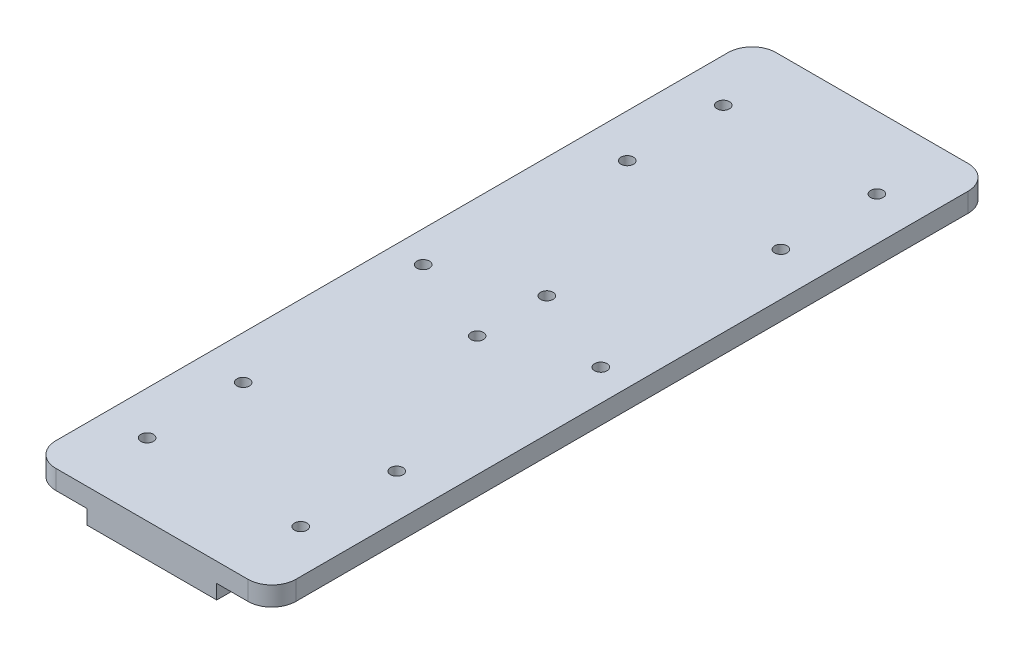
ISO-10303-21;
HEADER;
FILE_DESCRIPTION(('STEP AP214'),'2;1');
FILE_NAME('part.step','',(''),(''),'','','');
FILE_SCHEMA(('AUTOMOTIVE_DESIGN { 1 0 10303 214 1 1 1 1 }'));
ENDSEC;
DATA;
#1=APPLICATION_CONTEXT('core data for automotive mechanical design processes');
#2=APPLICATION_PROTOCOL_DEFINITION('international standard','automotive_design',2000,#1);
#3=PRODUCT_CONTEXT('',#1,'mechanical');
#4=PRODUCT('Part','Part','',(#3));
#5=PRODUCT_RELATED_PRODUCT_CATEGORY('part','',(#4));
#6=PRODUCT_DEFINITION_FORMATION('','',#4);
#7=PRODUCT_DEFINITION_CONTEXT('part definition',#1,'design');
#8=PRODUCT_DEFINITION('design','',#6,#7);
#9=PRODUCT_DEFINITION_SHAPE('','',#8);
#10=(LENGTH_UNIT() NAMED_UNIT(*) SI_UNIT(.MILLI.,.METRE.));
#11=(NAMED_UNIT(*) PLANE_ANGLE_UNIT() SI_UNIT($,.RADIAN.));
#12=(NAMED_UNIT(*) SI_UNIT($,.STERADIAN.) SOLID_ANGLE_UNIT());
#13=UNCERTAINTY_MEASURE_WITH_UNIT(LENGTH_MEASURE(1.E-05),#10,'distance_accuracy_value','');
#14=(GEOMETRIC_REPRESENTATION_CONTEXT(3) GLOBAL_UNCERTAINTY_ASSIGNED_CONTEXT((#13)) GLOBAL_UNIT_ASSIGNED_CONTEXT((#10,
#11,#12)) REPRESENTATION_CONTEXT('',''));
#15=CARTESIAN_POINT('',(0.,0.,0.));
#16=DIRECTION('',(0.,0.,1.));
#17=DIRECTION('',(1.,0.,0.));
#18=AXIS2_PLACEMENT_3D('',#15,#16,#17);
#19=CARTESIAN_POINT('',(0.,0.,0.));
#20=DIRECTION('',(0.,1.,0.));
#21=DIRECTION('',(0.,0.,1.));
#22=AXIS2_PLACEMENT_3D('',#19,#20,#21);
#23=PLANE('',#22);
#24=CARTESIAN_POINT('',(0.,0.,7.24999999999999));
#25=DIRECTION('',(0.,1.,0.));
#26=DIRECTION('',(0.,0.,1.));
#27=AXIS2_PLACEMENT_3D('',#24,#25,#26);
#28=CIRCLE('',#27,1.3);
#29=CARTESIAN_POINT('',(0.,0.,8.54999999999999));
#30=VERTEX_POINT('',#29);
#31=EDGE_CURVE('E271',#30,#30,#28,.T.);
#32=ORIENTED_EDGE('',*,*,#31,.T.);
#33=EDGE_LOOP('',(#32));
#34=FACE_BOUND('',#33,.T.);
#35=CARTESIAN_POINT('',(-18.5,0.,0.));
#36=DIRECTION('',(0.,1.,0.));
#37=DIRECTION('',(0.,0.,1.));
#38=AXIS2_PLACEMENT_3D('',#35,#36,#37);
#39=CIRCLE('',#38,1.3);
#40=CARTESIAN_POINT('',(-18.5,0.,1.3));
#41=VERTEX_POINT('',#40);
#42=EDGE_CURVE('E265',#41,#41,#39,.T.);
#43=ORIENTED_EDGE('',*,*,#42,.T.);
#44=EDGE_LOOP('',(#43));
#45=FACE_BOUND('',#44,.T.);
#46=CARTESIAN_POINT('',(0.,0.,-7.25000000000001));
#47=DIRECTION('',(0.,1.,0.));
#48=DIRECTION('',(0.,0.,1.));
#49=AXIS2_PLACEMENT_3D('',#46,#47,#48);
#50=CIRCLE('',#49,1.3);
#51=CARTESIAN_POINT('',(0.,0.,-5.95000000000001));
#52=VERTEX_POINT('',#51);
#53=EDGE_CURVE('E259',#52,#52,#50,.T.);
#54=ORIENTED_EDGE('',*,*,#53,.T.);
#55=EDGE_LOOP('',(#54));
#56=FACE_BOUND('',#55,.T.);
#57=CARTESIAN_POINT('',(18.5,0.,0.));
#58=DIRECTION('',(0.,1.,0.));
#59=DIRECTION('',(0.,0.,1.));
#60=AXIS2_PLACEMENT_3D('',#57,#58,#59);
#61=CIRCLE('',#60,1.3);
#62=CARTESIAN_POINT('',(18.5,0.,1.29999999999999));
#63=VERTEX_POINT('',#62);
#64=EDGE_CURVE('E253',#63,#63,#61,.T.);
#65=ORIENTED_EDGE('',*,*,#64,.T.);
#66=EDGE_LOOP('',(#65));
#67=FACE_BOUND('',#66,.T.);
#68=CARTESIAN_POINT('',(-16.,0.,40.));
#69=DIRECTION('',(0.,1.,0.));
#70=DIRECTION('',(0.,0.,1.));
#71=AXIS2_PLACEMENT_3D('',#68,#69,#70);
#72=CIRCLE('',#71,1.3);
#73=CARTESIAN_POINT('',(-16.,0.,41.3));
#74=VERTEX_POINT('',#73);
#75=EDGE_CURVE('E247',#74,#74,#72,.T.);
#76=ORIENTED_EDGE('',*,*,#75,.T.);
#77=EDGE_LOOP('',(#76));
#78=FACE_BOUND('',#77,.T.);
#79=CARTESIAN_POINT('',(16.,0.,40.));
#80=DIRECTION('',(0.,1.,0.));
#81=DIRECTION('',(0.,0.,1.));
#82=AXIS2_PLACEMENT_3D('',#79,#80,#81);
#83=CIRCLE('',#82,1.3);
#84=CARTESIAN_POINT('',(16.,0.,41.3));
#85=VERTEX_POINT('',#84);
#86=EDGE_CURVE('E241',#85,#85,#83,.T.);
#87=ORIENTED_EDGE('',*,*,#86,.T.);
#88=EDGE_LOOP('',(#87));
#89=FACE_BOUND('',#88,.T.);
#90=CARTESIAN_POINT('',(-16.,0.,60.));
#91=DIRECTION('',(0.,1.,0.));
#92=DIRECTION('',(0.,0.,1.));
#93=AXIS2_PLACEMENT_3D('',#90,#91,#92);
#94=CIRCLE('',#93,1.3);
#95=CARTESIAN_POINT('',(-16.,0.,61.3));
#96=VERTEX_POINT('',#95);
#97=EDGE_CURVE('E235',#96,#96,#94,.T.);
#98=ORIENTED_EDGE('',*,*,#97,.T.);
#99=EDGE_LOOP('',(#98));
#100=FACE_BOUND('',#99,.T.);
#101=CARTESIAN_POINT('',(16.,0.,60.));
#102=DIRECTION('',(0.,1.,0.));
#103=DIRECTION('',(0.,0.,1.));
#104=AXIS2_PLACEMENT_3D('',#101,#102,#103);
#105=CIRCLE('',#104,1.3);
#106=CARTESIAN_POINT('',(16.,0.,61.3));
#107=VERTEX_POINT('',#106);
#108=EDGE_CURVE('E229',#107,#107,#105,.T.);
#109=ORIENTED_EDGE('',*,*,#108,.T.);
#110=EDGE_LOOP('',(#109));
#111=FACE_BOUND('',#110,.T.);
#112=CARTESIAN_POINT('',(-16.,0.,-40.));
#113=DIRECTION('',(0.,1.,0.));
#114=DIRECTION('',(0.,0.,1.));
#115=AXIS2_PLACEMENT_3D('',#112,#113,#114);
#116=CIRCLE('',#115,1.3);
#117=CARTESIAN_POINT('',(-16.,0.,-38.7));
#118=VERTEX_POINT('',#117);
#119=EDGE_CURVE('E223',#118,#118,#116,.T.);
#120=ORIENTED_EDGE('',*,*,#119,.T.);
#121=EDGE_LOOP('',(#120));
#122=FACE_BOUND('',#121,.T.);
#123=CARTESIAN_POINT('',(16.,0.,-40.));
#124=DIRECTION('',(0.,1.,0.));
#125=DIRECTION('',(0.,0.,1.));
#126=AXIS2_PLACEMENT_3D('',#123,#124,#125);
#127=CIRCLE('',#126,1.3);
#128=CARTESIAN_POINT('',(16.,0.,-38.7));
#129=VERTEX_POINT('',#128);
#130=EDGE_CURVE('E217',#129,#129,#127,.T.);
#131=ORIENTED_EDGE('',*,*,#130,.T.);
#132=EDGE_LOOP('',(#131));
#133=FACE_BOUND('',#132,.T.);
#134=CARTESIAN_POINT('',(-16.,0.,-60.));
#135=DIRECTION('',(0.,1.,0.));
#136=DIRECTION('',(0.,0.,1.));
#137=AXIS2_PLACEMENT_3D('',#134,#135,#136);
#138=CIRCLE('',#137,1.3);
#139=CARTESIAN_POINT('',(-16.,0.,-58.7));
#140=VERTEX_POINT('',#139);
#141=EDGE_CURVE('E211',#140,#140,#138,.T.);
#142=ORIENTED_EDGE('',*,*,#141,.T.);
#143=EDGE_LOOP('',(#142));
#144=FACE_BOUND('',#143,.T.);
#145=CARTESIAN_POINT('',(16.,0.,-60.));
#146=DIRECTION('',(0.,1.,0.));
#147=DIRECTION('',(0.,0.,1.));
#148=AXIS2_PLACEMENT_3D('',#145,#146,#147);
#149=CIRCLE('',#148,1.3);
#150=CARTESIAN_POINT('',(16.,0.,-58.7));
#151=VERTEX_POINT('',#150);
#152=EDGE_CURVE('E207',#151,#151,#149,.T.);
#153=ORIENTED_EDGE('',*,*,#152,.T.);
#154=EDGE_LOOP('',(#153));
#155=FACE_BOUND('',#154,.T.);
#156=DIRECTION('',(0.,0.,1.));
#157=VECTOR('',#156,1.);
#158=CARTESIAN_POINT('',(-25.,0.,-75.));
#159=LINE('',#158,#157);
#160=CARTESIAN_POINT('',(-25.,0.,-70.));
#161=VERTEX_POINT('',#160);
#162=CARTESIAN_POINT('',(-25.,0.,70.));
#163=VERTEX_POINT('',#162);
#164=EDGE_CURVE('E297',#161,#163,#159,.T.);
#165=ORIENTED_EDGE('',*,*,#164,.F.);
#166=CARTESIAN_POINT('',(-20.,0.,-70.));
#167=DIRECTION('',(0.,1.,0.));
#168=DIRECTION('',(0.,0.,1.));
#169=AXIS2_PLACEMENT_3D('',#166,#167,#168);
#170=CIRCLE('',#169,5.);
#171=CARTESIAN_POINT('',(-20.,0.,-75.));
#172=VERTEX_POINT('',#171);
#173=EDGE_CURVE('E312',#161,#172,#170,.F.);
#174=ORIENTED_EDGE('',*,*,#173,.T.);
#175=DIRECTION('',(-1.,0.,0.));
#176=VECTOR('',#175,1.);
#177=CARTESIAN_POINT('',(-25.,0.,-75.));
#178=LINE('',#177,#176);
#179=CARTESIAN_POINT('',(-13.5,0.,-75.));
#180=VERTEX_POINT('',#179);
#181=EDGE_CURVE('E294',#180,#172,#178,.T.);
#182=ORIENTED_EDGE('',*,*,#181,.F.);
#183=DIRECTION('',(0.,0.,-1.));
#184=VECTOR('',#183,1.);
#185=CARTESIAN_POINT('',(-13.5,0.,-12.5));
#186=LINE('',#185,#184);
#187=CARTESIAN_POINT('',(-13.5,0.,-12.5));
#188=VERTEX_POINT('',#187);
#189=EDGE_CURVE('E185',#188,#180,#186,.T.);
#190=ORIENTED_EDGE('',*,*,#189,.F.);
#191=DIRECTION('',(-1.,0.,0.));
#192=VECTOR('',#191,1.);
#193=CARTESIAN_POINT('',(-13.5,0.,-12.5));
#194=LINE('',#193,#192);
#195=CARTESIAN_POINT('',(13.5,0.,-12.5));
#196=VERTEX_POINT('',#195);
#197=EDGE_CURVE('E175',#196,#188,#194,.T.);
#198=ORIENTED_EDGE('',*,*,#197,.F.);
#199=DIRECTION('',(0.,0.,1.));
#200=VECTOR('',#199,1.);
#201=CARTESIAN_POINT('',(13.5,0.,-12.5));
#202=LINE('',#201,#200);
#203=CARTESIAN_POINT('',(13.5,0.,-75.));
#204=VERTEX_POINT('',#203);
#205=EDGE_CURVE('E172',#204,#196,#202,.T.);
#206=ORIENTED_EDGE('',*,*,#205,.F.);
#207=CARTESIAN_POINT('',(20.,0.,-75.));
#208=VERTEX_POINT('',#207);
#209=EDGE_CURVE('E295',#208,#204,#178,.T.);
#210=ORIENTED_EDGE('',*,*,#209,.F.);
#211=CARTESIAN_POINT('',(20.,0.,-70.));
#212=DIRECTION('',(0.,1.,0.));
#213=DIRECTION('',(0.,0.,1.));
#214=AXIS2_PLACEMENT_3D('',#211,#212,#213);
#215=CIRCLE('',#214,5.);
#216=CARTESIAN_POINT('',(25.,0.,-70.));
#217=VERTEX_POINT('',#216);
#218=EDGE_CURVE('E310',#208,#217,#215,.F.);
#219=ORIENTED_EDGE('',*,*,#218,.T.);
#220=DIRECTION('',(0.,0.,-1.));
#221=VECTOR('',#220,1.);
#222=CARTESIAN_POINT('',(25.,0.,-75.));
#223=LINE('',#222,#221);
#224=CARTESIAN_POINT('',(25.,0.,70.));
#225=VERTEX_POINT('',#224);
#226=EDGE_CURVE('E277',#225,#217,#223,.T.);
#227=ORIENTED_EDGE('',*,*,#226,.F.);
#228=CARTESIAN_POINT('',(20.,0.,70.));
#229=DIRECTION('',(0.,1.,0.));
#230=DIRECTION('',(0.,0.,1.));
#231=AXIS2_PLACEMENT_3D('',#228,#229,#230);
#232=CIRCLE('',#231,5.);
#233=CARTESIAN_POINT('',(20.,0.,75.));
#234=VERTEX_POINT('',#233);
#235=EDGE_CURVE('E308',#225,#234,#232,.F.);
#236=ORIENTED_EDGE('',*,*,#235,.T.);
#237=DIRECTION('',(1.,0.,0.));
#238=VECTOR('',#237,1.);
#239=CARTESIAN_POINT('',(-25.,0.,75.));
#240=LINE('',#239,#238);
#241=CARTESIAN_POINT('',(13.5,0.,75.));
#242=VERTEX_POINT('',#241);
#243=EDGE_CURVE('E300',#242,#234,#240,.T.);
#244=ORIENTED_EDGE('',*,*,#243,.F.);
#245=DIRECTION('',(0.,0.,1.));
#246=VECTOR('',#245,1.);
#247=CARTESIAN_POINT('',(13.5,0.,12.5));
#248=LINE('',#247,#246);
#249=CARTESIAN_POINT('',(13.5,0.,12.5));
#250=VERTEX_POINT('',#249);
#251=EDGE_CURVE('E171',#250,#242,#248,.T.);
#252=ORIENTED_EDGE('',*,*,#251,.F.);
#253=DIRECTION('',(1.,0.,0.));
#254=VECTOR('',#253,1.);
#255=CARTESIAN_POINT('',(-13.5,0.,12.5));
#256=LINE('',#255,#254);
#257=CARTESIAN_POINT('',(-13.5,0.,12.5));
#258=VERTEX_POINT('',#257);
#259=EDGE_CURVE('E167',#258,#250,#256,.T.);
#260=ORIENTED_EDGE('',*,*,#259,.F.);
#261=DIRECTION('',(0.,0.,-1.));
#262=VECTOR('',#261,1.);
#263=CARTESIAN_POINT('',(-13.5,0.,12.5));
#264=LINE('',#263,#262);
#265=CARTESIAN_POINT('',(-13.5,0.,75.));
#266=VERTEX_POINT('',#265);
#267=EDGE_CURVE('E338',#266,#258,#264,.T.);
#268=ORIENTED_EDGE('',*,*,#267,.F.);
#269=CARTESIAN_POINT('',(-20.,0.,75.));
#270=VERTEX_POINT('',#269);
#271=EDGE_CURVE('E284',#270,#266,#240,.T.);
#272=ORIENTED_EDGE('',*,*,#271,.F.);
#273=CARTESIAN_POINT('',(-20.,0.,70.));
#274=DIRECTION('',(0.,1.,0.));
#275=DIRECTION('',(0.,0.,1.));
#276=AXIS2_PLACEMENT_3D('',#273,#274,#275);
#277=CIRCLE('',#276,5.);
#278=EDGE_CURVE('E306',#270,#163,#277,.F.);
#279=ORIENTED_EDGE('',*,*,#278,.T.);
#280=EDGE_LOOP('',(#165,#174,#182,#190,#198,#206,#210,#219,#227,#236,#244,#252,#260,#268,#272,#279));
#281=FACE_BOUND('',#280,.T.);
#282=ADVANCED_FACE('F35',(#34,#45,#56,#67,#78,#89,#100,#111,#122,#133,#144,#155,#281),#23,.F.);
#283=CARTESIAN_POINT('',(0.,4.,0.));
#284=DIRECTION('',(0.,1.,0.));
#285=DIRECTION('',(0.,0.,1.));
#286=AXIS2_PLACEMENT_3D('',#283,#284,#285);
#287=PLANE('',#286);
#288=CARTESIAN_POINT('',(-16.,4.,-60.));
#289=DIRECTION('',(0.,1.,0.));
#290=DIRECTION('',(0.,0.,1.));
#291=AXIS2_PLACEMENT_3D('',#288,#289,#290);
#292=CIRCLE('',#291,1.3);
#293=CARTESIAN_POINT('',(-16.,4.,-58.7));
#294=VERTEX_POINT('',#293);
#295=EDGE_CURVE('E214',#294,#294,#292,.T.);
#296=ORIENTED_EDGE('',*,*,#295,.F.);
#297=EDGE_LOOP('',(#296));
#298=FACE_BOUND('',#297,.T.);
#299=CARTESIAN_POINT('',(-16.,4.,-40.));
#300=DIRECTION('',(0.,1.,0.));
#301=DIRECTION('',(0.,0.,1.));
#302=AXIS2_PLACEMENT_3D('',#299,#300,#301);
#303=CIRCLE('',#302,1.3);
#304=CARTESIAN_POINT('',(-16.,4.,-38.7));
#305=VERTEX_POINT('',#304);
#306=EDGE_CURVE('E226',#305,#305,#303,.T.);
#307=ORIENTED_EDGE('',*,*,#306,.F.);
#308=EDGE_LOOP('',(#307));
#309=FACE_BOUND('',#308,.T.);
#310=CARTESIAN_POINT('',(-16.,4.,60.));
#311=DIRECTION('',(0.,1.,0.));
#312=DIRECTION('',(0.,0.,1.));
#313=AXIS2_PLACEMENT_3D('',#310,#311,#312);
#314=CIRCLE('',#313,1.3);
#315=CARTESIAN_POINT('',(-16.,4.,61.3));
#316=VERTEX_POINT('',#315);
#317=EDGE_CURVE('E238',#316,#316,#314,.T.);
#318=ORIENTED_EDGE('',*,*,#317,.F.);
#319=EDGE_LOOP('',(#318));
#320=FACE_BOUND('',#319,.T.);
#321=CARTESIAN_POINT('',(-16.,4.,40.));
#322=DIRECTION('',(0.,1.,0.));
#323=DIRECTION('',(0.,0.,1.));
#324=AXIS2_PLACEMENT_3D('',#321,#322,#323);
#325=CIRCLE('',#324,1.3);
#326=CARTESIAN_POINT('',(-16.,4.,41.3));
#327=VERTEX_POINT('',#326);
#328=EDGE_CURVE('E250',#327,#327,#325,.T.);
#329=ORIENTED_EDGE('',*,*,#328,.F.);
#330=EDGE_LOOP('',(#329));
#331=FACE_BOUND('',#330,.T.);
#332=CARTESIAN_POINT('',(0.,4.,-7.25000000000001));
#333=DIRECTION('',(0.,1.,0.));
#334=DIRECTION('',(0.,0.,1.));
#335=AXIS2_PLACEMENT_3D('',#332,#333,#334);
#336=CIRCLE('',#335,1.3);
#337=CARTESIAN_POINT('',(0.,4.,-5.95000000000001));
#338=VERTEX_POINT('',#337);
#339=EDGE_CURVE('E262',#338,#338,#336,.T.);
#340=ORIENTED_EDGE('',*,*,#339,.F.);
#341=EDGE_LOOP('',(#340));
#342=FACE_BOUND('',#341,.T.);
#343=CARTESIAN_POINT('',(0.,4.,7.24999999999999));
#344=DIRECTION('',(0.,1.,0.));
#345=DIRECTION('',(0.,0.,1.));
#346=AXIS2_PLACEMENT_3D('',#343,#344,#345);
#347=CIRCLE('',#346,1.3);
#348=CARTESIAN_POINT('',(0.,4.,8.54999999999999));
#349=VERTEX_POINT('',#348);
#350=EDGE_CURVE('E274',#349,#349,#347,.T.);
#351=ORIENTED_EDGE('',*,*,#350,.F.);
#352=EDGE_LOOP('',(#351));
#353=FACE_BOUND('',#352,.T.);
#354=DIRECTION('',(-1.,0.,0.));
#355=VECTOR('',#354,1.);
#356=CARTESIAN_POINT('',(-25.,4.,-75.));
#357=LINE('',#356,#355);
#358=CARTESIAN_POINT('',(20.,4.,-75.));
#359=VERTEX_POINT('',#358);
#360=CARTESIAN_POINT('',(-20.,4.,-75.));
#361=VERTEX_POINT('',#360);
#362=EDGE_CURVE('E283',#359,#361,#357,.T.);
#363=ORIENTED_EDGE('',*,*,#362,.T.);
#364=CARTESIAN_POINT('',(-20.,4.,-70.));
#365=DIRECTION('',(0.,1.,0.));
#366=DIRECTION('',(0.,0.,1.));
#367=AXIS2_PLACEMENT_3D('',#364,#365,#366);
#368=CIRCLE('',#367,5.);
#369=CARTESIAN_POINT('',(-25.,4.,-70.));
#370=VERTEX_POINT('',#369);
#371=EDGE_CURVE('E324',#361,#370,#368,.T.);
#372=ORIENTED_EDGE('',*,*,#371,.T.);
#373=DIRECTION('',(0.,0.,1.));
#374=VECTOR('',#373,1.);
#375=CARTESIAN_POINT('',(-25.,4.,-75.));
#376=LINE('',#375,#374);
#377=CARTESIAN_POINT('',(-25.,4.,70.));
#378=VERTEX_POINT('',#377);
#379=EDGE_CURVE('E287',#370,#378,#376,.T.);
#380=ORIENTED_EDGE('',*,*,#379,.T.);
#381=CARTESIAN_POINT('',(-20.,4.,70.));
#382=DIRECTION('',(0.,1.,0.));
#383=DIRECTION('',(0.,0.,1.));
#384=AXIS2_PLACEMENT_3D('',#381,#382,#383);
#385=CIRCLE('',#384,5.);
#386=CARTESIAN_POINT('',(-20.,4.,75.));
#387=VERTEX_POINT('',#386);
#388=EDGE_CURVE('E55',#378,#387,#385,.T.);
#389=ORIENTED_EDGE('',*,*,#388,.T.);
#390=DIRECTION('',(1.,0.,0.));
#391=VECTOR('',#390,1.);
#392=CARTESIAN_POINT('',(-25.,4.,75.));
#393=LINE('',#392,#391);
#394=CARTESIAN_POINT('',(20.,4.,75.));
#395=VERTEX_POINT('',#394);
#396=EDGE_CURVE('E289',#387,#395,#393,.T.);
#397=ORIENTED_EDGE('',*,*,#396,.T.);
#398=CARTESIAN_POINT('',(20.,4.,70.));
#399=DIRECTION('',(0.,1.,0.));
#400=DIRECTION('',(0.,0.,1.));
#401=AXIS2_PLACEMENT_3D('',#398,#399,#400);
#402=CIRCLE('',#401,5.);
#403=CARTESIAN_POINT('',(25.,4.,70.));
#404=VERTEX_POINT('',#403);
#405=EDGE_CURVE('E320',#395,#404,#402,.T.);
#406=ORIENTED_EDGE('',*,*,#405,.T.);
#407=DIRECTION('',(0.,0.,-1.));
#408=VECTOR('',#407,1.);
#409=CARTESIAN_POINT('',(25.,4.,-75.));
#410=LINE('',#409,#408);
#411=CARTESIAN_POINT('',(25.,4.,-70.));
#412=VERTEX_POINT('',#411);
#413=EDGE_CURVE('E280',#404,#412,#410,.T.);
#414=ORIENTED_EDGE('',*,*,#413,.T.);
#415=CARTESIAN_POINT('',(20.,4.,-70.));
#416=DIRECTION('',(0.,1.,0.));
#417=DIRECTION('',(0.,0.,1.));
#418=AXIS2_PLACEMENT_3D('',#415,#416,#417);
#419=CIRCLE('',#418,5.);
#420=EDGE_CURVE('E322',#412,#359,#419,.T.);
#421=ORIENTED_EDGE('',*,*,#420,.T.);
#422=EDGE_LOOP('',(#363,#372,#380,#389,#397,#406,#414,#421));
#423=FACE_BOUND('',#422,.T.);
#424=CARTESIAN_POINT('',(-18.5,4.,0.));
#425=DIRECTION('',(0.,1.,0.));
#426=DIRECTION('',(0.,0.,1.));
#427=AXIS2_PLACEMENT_3D('',#424,#425,#426);
#428=CIRCLE('',#427,1.3);
#429=CARTESIAN_POINT('',(-18.5,4.,1.3));
#430=VERTEX_POINT('',#429);
#431=EDGE_CURVE('E268',#430,#430,#428,.T.);
#432=ORIENTED_EDGE('',*,*,#431,.F.);
#433=EDGE_LOOP('',(#432));
#434=FACE_BOUND('',#433,.T.);
#435=CARTESIAN_POINT('',(18.5,4.,0.));
#436=DIRECTION('',(0.,1.,0.));
#437=DIRECTION('',(0.,0.,1.));
#438=AXIS2_PLACEMENT_3D('',#435,#436,#437);
#439=CIRCLE('',#438,1.3);
#440=CARTESIAN_POINT('',(18.5,4.,1.29999999999999));
#441=VERTEX_POINT('',#440);
#442=EDGE_CURVE('E256',#441,#441,#439,.T.);
#443=ORIENTED_EDGE('',*,*,#442,.F.);
#444=EDGE_LOOP('',(#443));
#445=FACE_BOUND('',#444,.T.);
#446=CARTESIAN_POINT('',(16.,4.,40.));
#447=DIRECTION('',(0.,1.,0.));
#448=DIRECTION('',(0.,0.,1.));
#449=AXIS2_PLACEMENT_3D('',#446,#447,#448);
#450=CIRCLE('',#449,1.3);
#451=CARTESIAN_POINT('',(16.,4.,41.3));
#452=VERTEX_POINT('',#451);
#453=EDGE_CURVE('E244',#452,#452,#450,.T.);
#454=ORIENTED_EDGE('',*,*,#453,.F.);
#455=EDGE_LOOP('',(#454));
#456=FACE_BOUND('',#455,.T.);
#457=CARTESIAN_POINT('',(16.,4.,60.));
#458=DIRECTION('',(0.,1.,0.));
#459=DIRECTION('',(0.,0.,1.));
#460=AXIS2_PLACEMENT_3D('',#457,#458,#459);
#461=CIRCLE('',#460,1.3);
#462=CARTESIAN_POINT('',(16.,4.,61.3));
#463=VERTEX_POINT('',#462);
#464=EDGE_CURVE('E232',#463,#463,#461,.T.);
#465=ORIENTED_EDGE('',*,*,#464,.F.);
#466=EDGE_LOOP('',(#465));
#467=FACE_BOUND('',#466,.T.);
#468=CARTESIAN_POINT('',(16.,4.,-40.));
#469=DIRECTION('',(0.,1.,0.));
#470=DIRECTION('',(0.,0.,1.));
#471=AXIS2_PLACEMENT_3D('',#468,#469,#470);
#472=CIRCLE('',#471,1.3);
#473=CARTESIAN_POINT('',(16.,4.,-38.7));
#474=VERTEX_POINT('',#473);
#475=EDGE_CURVE('E220',#474,#474,#472,.T.);
#476=ORIENTED_EDGE('',*,*,#475,.F.);
#477=EDGE_LOOP('',(#476));
#478=FACE_BOUND('',#477,.T.);
#479=CARTESIAN_POINT('',(16.,4.,-60.));
#480=DIRECTION('',(0.,1.,0.));
#481=DIRECTION('',(0.,0.,1.));
#482=AXIS2_PLACEMENT_3D('',#479,#480,#481);
#483=CIRCLE('',#482,1.3);
#484=CARTESIAN_POINT('',(16.,4.,-58.7));
#485=VERTEX_POINT('',#484);
#486=EDGE_CURVE('E208',#485,#485,#483,.T.);
#487=ORIENTED_EDGE('',*,*,#486,.F.);
#488=EDGE_LOOP('',(#487));
#489=FACE_BOUND('',#488,.T.);
#490=ADVANCED_FACE('F362',(#298,#309,#320,#331,#342,#353,#423,#434,#445,#456,#467,#478,#489),
#287,.T.);
#491=CARTESIAN_POINT('',(25.,4.,-75.));
#492=DIRECTION('',(-1.,0.,0.));
#493=DIRECTION('',(0.,0.,1.));
#494=AXIS2_PLACEMENT_3D('',#491,#492,#493);
#495=PLANE('',#494);
#496=ORIENTED_EDGE('',*,*,#226,.T.);
#497=DIRECTION('',(0.,-1.,0.));
#498=VECTOR('',#497,1.);
#499=CARTESIAN_POINT('',(25.,4.,-70.));
#500=LINE('',#499,#498);
#501=EDGE_CURVE('E329',#217,#412,#500,.F.);
#502=ORIENTED_EDGE('',*,*,#501,.T.);
#503=ORIENTED_EDGE('',*,*,#413,.F.);
#504=DIRECTION('',(0.,-1.,0.));
#505=VECTOR('',#504,1.);
#506=CARTESIAN_POINT('',(25.,4.,70.));
#507=LINE('',#506,#505);
#508=EDGE_CURVE('E326',#404,#225,#507,.T.);
#509=ORIENTED_EDGE('',*,*,#508,.T.);
#510=EDGE_LOOP('',(#496,#502,#503,#509));
#511=FACE_BOUND('',#510,.T.);
#512=ADVANCED_FACE('F369',(#511),#495,.F.);
#513=CARTESIAN_POINT('',(-25.,4.,-75.));
#514=DIRECTION('',(0.,0.,1.));
#515=DIRECTION('',(1.,0.,0.));
#516=AXIS2_PLACEMENT_3D('',#513,#514,#515);
#517=PLANE('',#516);
#518=ORIENTED_EDGE('',*,*,#181,.T.);
#519=DIRECTION('',(0.,-1.,0.));
#520=VECTOR('',#519,1.);
#521=CARTESIAN_POINT('',(-20.,4.,-75.));
#522=LINE('',#521,#520);
#523=EDGE_CURVE('E317',#172,#361,#522,.F.);
#524=ORIENTED_EDGE('',*,*,#523,.T.);
#525=ORIENTED_EDGE('',*,*,#362,.F.);
#526=DIRECTION('',(0.,-1.,0.));
#527=VECTOR('',#526,1.);
#528=CARTESIAN_POINT('',(20.,4.,-75.));
#529=LINE('',#528,#527);
#530=EDGE_CURVE('E314',#359,#208,#529,.T.);
#531=ORIENTED_EDGE('',*,*,#530,.T.);
#532=ORIENTED_EDGE('',*,*,#209,.T.);
#533=DIRECTION('',(0.,1.,0.));
#534=VECTOR('',#533,1.);
#535=CARTESIAN_POINT('',(13.5,-3.,-75.));
#536=LINE('',#535,#534);
#537=CARTESIAN_POINT('',(13.5,-3.,-75.));
#538=VERTEX_POINT('',#537);
#539=EDGE_CURVE('E204',#538,#204,#536,.T.);
#540=ORIENTED_EDGE('',*,*,#539,.F.);
#541=DIRECTION('',(1.,0.,0.));
#542=VECTOR('',#541,1.);
#543=CARTESIAN_POINT('',(-13.5,-3.,-75.));
#544=LINE('',#543,#542);
#545=CARTESIAN_POINT('',(-13.5,-3.,-75.));
#546=VERTEX_POINT('',#545);
#547=EDGE_CURVE('E181',#546,#538,#544,.T.);
#548=ORIENTED_EDGE('',*,*,#547,.F.);
#549=DIRECTION('',(0.,1.,0.));
#550=VECTOR('',#549,1.);
#551=CARTESIAN_POINT('',(-13.5,-3.,-75.));
#552=LINE('',#551,#550);
#553=EDGE_CURVE('E190',#546,#180,#552,.T.);
#554=ORIENTED_EDGE('',*,*,#553,.T.);
#555=EDGE_LOOP('',(#518,#524,#525,#531,#532,#540,#548,#554));
#556=FACE_BOUND('',#555,.T.);
#557=ADVANCED_FACE('F381',(#556),#517,.F.);
#558=CARTESIAN_POINT('',(-25.,4.,-75.));
#559=DIRECTION('',(1.,0.,0.));
#560=DIRECTION('',(0.,0.,-1.));
#561=AXIS2_PLACEMENT_3D('',#558,#559,#560);
#562=PLANE('',#561);
#563=ORIENTED_EDGE('',*,*,#379,.F.);
#564=DIRECTION('',(0.,-1.,0.));
#565=VECTOR('',#564,1.);
#566=CARTESIAN_POINT('',(-25.,4.,-70.));
#567=LINE('',#566,#565);
#568=EDGE_CURVE('E303',#370,#161,#567,.T.);
#569=ORIENTED_EDGE('',*,*,#568,.T.);
#570=ORIENTED_EDGE('',*,*,#164,.T.);
#571=DIRECTION('',(0.,-1.,0.));
#572=VECTOR('',#571,1.);
#573=CARTESIAN_POINT('',(-25.,4.,70.));
#574=LINE('',#573,#572);
#575=EDGE_CURVE('E291',#163,#378,#574,.F.);
#576=ORIENTED_EDGE('',*,*,#575,.T.);
#577=EDGE_LOOP('',(#563,#569,#570,#576));
#578=FACE_BOUND('',#577,.T.);
#579=ADVANCED_FACE('F378',(#578),#562,.F.);
#580=CARTESIAN_POINT('',(-25.,4.,75.));
#581=DIRECTION('',(0.,0.,-1.));
#582=DIRECTION('',(-1.,0.,0.));
#583=AXIS2_PLACEMENT_3D('',#580,#581,#582);
#584=PLANE('',#583);
#585=ORIENTED_EDGE('',*,*,#243,.T.);
#586=DIRECTION('',(0.,-1.,0.));
#587=VECTOR('',#586,1.);
#588=CARTESIAN_POINT('',(20.,4.,75.));
#589=LINE('',#588,#587);
#590=EDGE_CURVE('E11',#234,#395,#589,.F.);
#591=ORIENTED_EDGE('',*,*,#590,.T.);
#592=ORIENTED_EDGE('',*,*,#396,.F.);
#593=DIRECTION('',(0.,-1.,0.));
#594=VECTOR('',#593,1.);
#595=CARTESIAN_POINT('',(-20.,4.,75.));
#596=LINE('',#595,#594);
#597=EDGE_CURVE('E43',#387,#270,#596,.T.);
#598=ORIENTED_EDGE('',*,*,#597,.T.);
#599=ORIENTED_EDGE('',*,*,#271,.T.);
#600=DIRECTION('',(0.,1.,0.));
#601=VECTOR('',#600,1.);
#602=CARTESIAN_POINT('',(-13.5,-3.,75.));
#603=LINE('',#602,#601);
#604=CARTESIAN_POINT('',(-13.5,-3.,75.));
#605=VERTEX_POINT('',#604);
#606=EDGE_CURVE('E154',#605,#266,#603,.T.);
#607=ORIENTED_EDGE('',*,*,#606,.F.);
#608=DIRECTION('',(-1.,0.,0.));
#609=VECTOR('',#608,1.);
#610=CARTESIAN_POINT('',(-13.5,-3.,75.));
#611=LINE('',#610,#609);
#612=CARTESIAN_POINT('',(13.5,-3.,75.));
#613=VERTEX_POINT('',#612);
#614=EDGE_CURVE('E147',#613,#605,#611,.T.);
#615=ORIENTED_EDGE('',*,*,#614,.F.);
#616=DIRECTION('',(0.,1.,0.));
#617=VECTOR('',#616,1.);
#618=CARTESIAN_POINT('',(13.5,-3.,75.));
#619=LINE('',#618,#617);
#620=EDGE_CURVE('E151',#613,#242,#619,.T.);
#621=ORIENTED_EDGE('',*,*,#620,.T.);
#622=EDGE_LOOP('',(#585,#591,#592,#598,#599,#607,#615,#621));
#623=FACE_BOUND('',#622,.T.);
#624=ADVANCED_FACE('F149',(#623),#584,.F.);
#625=CARTESIAN_POINT('',(0.,4.,7.24999999999999));
#626=DIRECTION('',(0.,-1.,0.));
#627=DIRECTION('',(0.,0.,-1.));
#628=AXIS2_PLACEMENT_3D('',#625,#626,#627);
#629=CYLINDRICAL_SURFACE('',#628,1.3);
#630=ORIENTED_EDGE('',*,*,#350,.T.);
#631=EDGE_LOOP('',(#630));
#632=FACE_BOUND('',#631,.T.);
#633=ORIENTED_EDGE('',*,*,#31,.F.);
#634=EDGE_LOOP('',(#633));
#635=FACE_BOUND('',#634,.T.);
#636=ADVANCED_FACE('F377',(#632,#635),#629,.F.);
#637=CARTESIAN_POINT('',(-18.5,4.,0.));
#638=DIRECTION('',(0.,-1.,0.));
#639=DIRECTION('',(0.,0.,-1.));
#640=AXIS2_PLACEMENT_3D('',#637,#638,#639);
#641=CYLINDRICAL_SURFACE('',#640,1.3);
#642=ORIENTED_EDGE('',*,*,#431,.T.);
#643=EDGE_LOOP('',(#642));
#644=FACE_BOUND('',#643,.T.);
#645=ORIENTED_EDGE('',*,*,#42,.F.);
#646=EDGE_LOOP('',(#645));
#647=FACE_BOUND('',#646,.T.);
#648=ADVANCED_FACE('F480',(#644,#647),#641,.F.);
#649=CARTESIAN_POINT('',(0.,4.,-7.25000000000001));
#650=DIRECTION('',(0.,-1.,0.));
#651=DIRECTION('',(0.,0.,-1.));
#652=AXIS2_PLACEMENT_3D('',#649,#650,#651);
#653=CYLINDRICAL_SURFACE('',#652,1.3);
#654=ORIENTED_EDGE('',*,*,#339,.T.);
#655=EDGE_LOOP('',(#654));
#656=FACE_BOUND('',#655,.T.);
#657=ORIENTED_EDGE('',*,*,#53,.F.);
#658=EDGE_LOOP('',(#657));
#659=FACE_BOUND('',#658,.T.);
#660=ADVANCED_FACE('F476',(#656,#659),#653,.F.);
#661=CARTESIAN_POINT('',(18.5,4.,0.));
#662=DIRECTION('',(0.,-1.,0.));
#663=DIRECTION('',(0.,0.,-1.));
#664=AXIS2_PLACEMENT_3D('',#661,#662,#663);
#665=CYLINDRICAL_SURFACE('',#664,1.3);
#666=ORIENTED_EDGE('',*,*,#442,.T.);
#667=EDGE_LOOP('',(#666));
#668=FACE_BOUND('',#667,.T.);
#669=ORIENTED_EDGE('',*,*,#64,.F.);
#670=EDGE_LOOP('',(#669));
#671=FACE_BOUND('',#670,.T.);
#672=ADVANCED_FACE('F472',(#668,#671),#665,.F.);
#673=CARTESIAN_POINT('',(-16.,4.,40.));
#674=DIRECTION('',(0.,-1.,0.));
#675=DIRECTION('',(0.,0.,-1.));
#676=AXIS2_PLACEMENT_3D('',#673,#674,#675);
#677=CYLINDRICAL_SURFACE('',#676,1.3);
#678=ORIENTED_EDGE('',*,*,#328,.T.);
#679=EDGE_LOOP('',(#678));
#680=FACE_BOUND('',#679,.T.);
#681=ORIENTED_EDGE('',*,*,#75,.F.);
#682=EDGE_LOOP('',(#681));
#683=FACE_BOUND('',#682,.T.);
#684=ADVANCED_FACE('F468',(#680,#683),#677,.F.);
#685=CARTESIAN_POINT('',(16.,4.,40.));
#686=DIRECTION('',(0.,-1.,0.));
#687=DIRECTION('',(0.,0.,-1.));
#688=AXIS2_PLACEMENT_3D('',#685,#686,#687);
#689=CYLINDRICAL_SURFACE('',#688,1.3);
#690=ORIENTED_EDGE('',*,*,#453,.T.);
#691=EDGE_LOOP('',(#690));
#692=FACE_BOUND('',#691,.T.);
#693=ORIENTED_EDGE('',*,*,#86,.F.);
#694=EDGE_LOOP('',(#693));
#695=FACE_BOUND('',#694,.T.);
#696=ADVANCED_FACE('F464',(#692,#695),#689,.F.);
#697=CARTESIAN_POINT('',(-16.,4.,60.));
#698=DIRECTION('',(0.,-1.,0.));
#699=DIRECTION('',(0.,0.,-1.));
#700=AXIS2_PLACEMENT_3D('',#697,#698,#699);
#701=CYLINDRICAL_SURFACE('',#700,1.3);
#702=ORIENTED_EDGE('',*,*,#317,.T.);
#703=EDGE_LOOP('',(#702));
#704=FACE_BOUND('',#703,.T.);
#705=ORIENTED_EDGE('',*,*,#97,.F.);
#706=EDGE_LOOP('',(#705));
#707=FACE_BOUND('',#706,.T.);
#708=ADVANCED_FACE('F460',(#704,#707),#701,.F.);
#709=CARTESIAN_POINT('',(16.,4.,60.));
#710=DIRECTION('',(0.,-1.,0.));
#711=DIRECTION('',(0.,0.,-1.));
#712=AXIS2_PLACEMENT_3D('',#709,#710,#711);
#713=CYLINDRICAL_SURFACE('',#712,1.3);
#714=ORIENTED_EDGE('',*,*,#464,.T.);
#715=EDGE_LOOP('',(#714));
#716=FACE_BOUND('',#715,.T.);
#717=ORIENTED_EDGE('',*,*,#108,.F.);
#718=EDGE_LOOP('',(#717));
#719=FACE_BOUND('',#718,.T.);
#720=ADVANCED_FACE('F456',(#716,#719),#713,.F.);
#721=CARTESIAN_POINT('',(-16.,4.,-40.));
#722=DIRECTION('',(0.,-1.,0.));
#723=DIRECTION('',(0.,0.,-1.));
#724=AXIS2_PLACEMENT_3D('',#721,#722,#723);
#725=CYLINDRICAL_SURFACE('',#724,1.3);
#726=ORIENTED_EDGE('',*,*,#306,.T.);
#727=EDGE_LOOP('',(#726));
#728=FACE_BOUND('',#727,.T.);
#729=ORIENTED_EDGE('',*,*,#119,.F.);
#730=EDGE_LOOP('',(#729));
#731=FACE_BOUND('',#730,.T.);
#732=ADVANCED_FACE('F452',(#728,#731),#725,.F.);
#733=CARTESIAN_POINT('',(16.,4.,-40.));
#734=DIRECTION('',(0.,-1.,0.));
#735=DIRECTION('',(0.,0.,-1.));
#736=AXIS2_PLACEMENT_3D('',#733,#734,#735);
#737=CYLINDRICAL_SURFACE('',#736,1.3);
#738=ORIENTED_EDGE('',*,*,#475,.T.);
#739=EDGE_LOOP('',(#738));
#740=FACE_BOUND('',#739,.T.);
#741=ORIENTED_EDGE('',*,*,#130,.F.);
#742=EDGE_LOOP('',(#741));
#743=FACE_BOUND('',#742,.T.);
#744=ADVANCED_FACE('F448',(#740,#743),#737,.F.);
#745=CARTESIAN_POINT('',(-16.,4.,-60.));
#746=DIRECTION('',(0.,-1.,0.));
#747=DIRECTION('',(0.,0.,-1.));
#748=AXIS2_PLACEMENT_3D('',#745,#746,#747);
#749=CYLINDRICAL_SURFACE('',#748,1.3);
#750=ORIENTED_EDGE('',*,*,#295,.T.);
#751=EDGE_LOOP('',(#750));
#752=FACE_BOUND('',#751,.T.);
#753=ORIENTED_EDGE('',*,*,#141,.F.);
#754=EDGE_LOOP('',(#753));
#755=FACE_BOUND('',#754,.T.);
#756=ADVANCED_FACE('F441',(#752,#755),#749,.F.);
#757=CARTESIAN_POINT('',(16.,4.,-60.));
#758=DIRECTION('',(0.,-1.,0.));
#759=DIRECTION('',(0.,0.,-1.));
#760=AXIS2_PLACEMENT_3D('',#757,#758,#759);
#761=CYLINDRICAL_SURFACE('',#760,1.3);
#762=ORIENTED_EDGE('',*,*,#486,.T.);
#763=EDGE_LOOP('',(#762));
#764=FACE_BOUND('',#763,.T.);
#765=ORIENTED_EDGE('',*,*,#152,.F.);
#766=EDGE_LOOP('',(#765));
#767=FACE_BOUND('',#766,.T.);
#768=ADVANCED_FACE('F434',(#764,#767),#761,.F.);
#769=CARTESIAN_POINT('',(13.5,-3.,-12.5));
#770=DIRECTION('',(-1.,0.,0.));
#771=DIRECTION('',(0.,0.,1.));
#772=AXIS2_PLACEMENT_3D('',#769,#770,#771);
#773=PLANE('',#772);
#774=ORIENTED_EDGE('',*,*,#205,.T.);
#775=DIRECTION('',(0.,1.,0.));
#776=VECTOR('',#775,1.);
#777=CARTESIAN_POINT('',(13.5,-3.,-12.5));
#778=LINE('',#777,#776);
#779=CARTESIAN_POINT('',(13.5,-3.,-12.5));
#780=VERTEX_POINT('',#779);
#781=EDGE_CURVE('E201',#780,#196,#778,.T.);
#782=ORIENTED_EDGE('',*,*,#781,.F.);
#783=DIRECTION('',(0.,0.,1.));
#784=VECTOR('',#783,1.);
#785=CARTESIAN_POINT('',(13.5,-3.,-12.5));
#786=LINE('',#785,#784);
#787=EDGE_CURVE('E184',#538,#780,#786,.T.);
#788=ORIENTED_EDGE('',*,*,#787,.F.);
#789=ORIENTED_EDGE('',*,*,#539,.T.);
#790=EDGE_LOOP('',(#774,#782,#788,#789));
#791=FACE_BOUND('',#790,.T.);
#792=ADVANCED_FACE('F432',(#791),#773,.F.);
#793=CARTESIAN_POINT('',(-13.5,-3.,-12.5));
#794=DIRECTION('',(0.,0.,-1.));
#795=DIRECTION('',(-1.,0.,0.));
#796=AXIS2_PLACEMENT_3D('',#793,#794,#795);
#797=PLANE('',#796);
#798=ORIENTED_EDGE('',*,*,#197,.T.);
#799=DIRECTION('',(0.,1.,0.));
#800=VECTOR('',#799,1.);
#801=CARTESIAN_POINT('',(-13.5,-3.,-12.5));
#802=LINE('',#801,#800);
#803=CARTESIAN_POINT('',(-13.5,-3.,-12.5));
#804=VERTEX_POINT('',#803);
#805=EDGE_CURVE('E198',#804,#188,#802,.T.);
#806=ORIENTED_EDGE('',*,*,#805,.F.);
#807=DIRECTION('',(-1.,0.,0.));
#808=VECTOR('',#807,1.);
#809=CARTESIAN_POINT('',(-13.5,-3.,-12.5));
#810=LINE('',#809,#808);
#811=EDGE_CURVE('E187',#780,#804,#810,.T.);
#812=ORIENTED_EDGE('',*,*,#811,.F.);
#813=ORIENTED_EDGE('',*,*,#781,.T.);
#814=EDGE_LOOP('',(#798,#806,#812,#813));
#815=FACE_BOUND('',#814,.T.);
#816=ADVANCED_FACE('F429',(#815),#797,.F.);
#817=CARTESIAN_POINT('',(-13.5,-3.,-12.5));
#818=DIRECTION('',(1.,0.,0.));
#819=DIRECTION('',(0.,0.,-1.));
#820=AXIS2_PLACEMENT_3D('',#817,#818,#819);
#821=PLANE('',#820);
#822=ORIENTED_EDGE('',*,*,#189,.T.);
#823=ORIENTED_EDGE('',*,*,#553,.F.);
#824=DIRECTION('',(0.,0.,-1.));
#825=VECTOR('',#824,1.);
#826=CARTESIAN_POINT('',(-13.5,-3.,-12.5));
#827=LINE('',#826,#825);
#828=EDGE_CURVE('E189',#804,#546,#827,.T.);
#829=ORIENTED_EDGE('',*,*,#828,.F.);
#830=ORIENTED_EDGE('',*,*,#805,.T.);
#831=EDGE_LOOP('',(#822,#823,#829,#830));
#832=FACE_BOUND('',#831,.T.);
#833=ADVANCED_FACE('F420',(#832),#821,.F.);
#834=CARTESIAN_POINT('',(0.,-3.,0.));
#835=DIRECTION('',(0.,1.,0.));
#836=DIRECTION('',(0.,0.,1.));
#837=AXIS2_PLACEMENT_3D('',#834,#835,#836);
#838=PLANE('',#837);
#839=ORIENTED_EDGE('',*,*,#547,.T.);
#840=ORIENTED_EDGE('',*,*,#787,.T.);
#841=ORIENTED_EDGE('',*,*,#811,.T.);
#842=ORIENTED_EDGE('',*,*,#828,.T.);
#843=EDGE_LOOP('',(#839,#840,#841,#842));
#844=FACE_BOUND('',#843,.T.);
#845=ADVANCED_FACE('F359',(#844),#838,.F.);
#846=CARTESIAN_POINT('',(13.5,-3.,12.5));
#847=DIRECTION('',(-1.,0.,0.));
#848=DIRECTION('',(0.,0.,1.));
#849=AXIS2_PLACEMENT_3D('',#846,#847,#848);
#850=PLANE('',#849);
#851=ORIENTED_EDGE('',*,*,#251,.T.);
#852=ORIENTED_EDGE('',*,*,#620,.F.);
#853=DIRECTION('',(0.,0.,1.));
#854=VECTOR('',#853,1.);
#855=CARTESIAN_POINT('',(13.5,-3.,12.5));
#856=LINE('',#855,#854);
#857=CARTESIAN_POINT('',(13.5,-3.,12.5));
#858=VERTEX_POINT('',#857);
#859=EDGE_CURVE('E158',#858,#613,#856,.T.);
#860=ORIENTED_EDGE('',*,*,#859,.F.);
#861=DIRECTION('',(0.,1.,0.));
#862=VECTOR('',#861,1.);
#863=CARTESIAN_POINT('',(13.5,-3.,12.5));
#864=LINE('',#863,#862);
#865=EDGE_CURVE('E347',#858,#250,#864,.T.);
#866=ORIENTED_EDGE('',*,*,#865,.T.);
#867=EDGE_LOOP('',(#851,#852,#860,#866));
#868=FACE_BOUND('',#867,.T.);
#869=ADVANCED_FACE('F169',(#868),#850,.F.);
#870=CARTESIAN_POINT('',(-13.5,-3.,12.5));
#871=DIRECTION('',(1.,0.,0.));
#872=DIRECTION('',(0.,0.,-1.));
#873=AXIS2_PLACEMENT_3D('',#870,#871,#872);
#874=PLANE('',#873);
#875=ORIENTED_EDGE('',*,*,#267,.T.);
#876=DIRECTION('',(0.,1.,0.));
#877=VECTOR('',#876,1.);
#878=CARTESIAN_POINT('',(-13.5,-3.,12.5));
#879=LINE('',#878,#877);
#880=CARTESIAN_POINT('',(-13.5,-3.,12.5));
#881=VERTEX_POINT('',#880);
#882=EDGE_CURVE('E177',#881,#258,#879,.T.);
#883=ORIENTED_EDGE('',*,*,#882,.F.);
#884=DIRECTION('',(0.,0.,-1.));
#885=VECTOR('',#884,1.);
#886=CARTESIAN_POINT('',(-13.5,-3.,12.5));
#887=LINE('',#886,#885);
#888=EDGE_CURVE('E157',#605,#881,#887,.T.);
#889=ORIENTED_EDGE('',*,*,#888,.F.);
#890=ORIENTED_EDGE('',*,*,#606,.T.);
#891=EDGE_LOOP('',(#875,#883,#889,#890));
#892=FACE_BOUND('',#891,.T.);
#893=ADVANCED_FACE('F350',(#892),#874,.F.);
#894=CARTESIAN_POINT('',(-13.5,-3.,12.5));
#895=DIRECTION('',(0.,0.,1.));
#896=DIRECTION('',(1.,0.,0.));
#897=AXIS2_PLACEMENT_3D('',#894,#895,#896);
#898=PLANE('',#897);
#899=ORIENTED_EDGE('',*,*,#259,.T.);
#900=ORIENTED_EDGE('',*,*,#865,.F.);
#901=DIRECTION('',(1.,0.,0.));
#902=VECTOR('',#901,1.);
#903=CARTESIAN_POINT('',(-13.5,-3.,12.5));
#904=LINE('',#903,#902);
#905=EDGE_CURVE('E163',#881,#858,#904,.T.);
#906=ORIENTED_EDGE('',*,*,#905,.F.);
#907=ORIENTED_EDGE('',*,*,#882,.T.);
#908=EDGE_LOOP('',(#899,#900,#906,#907));
#909=FACE_BOUND('',#908,.T.);
#910=ADVANCED_FACE('F349',(#909),#898,.F.);
#911=CARTESIAN_POINT('',(0.,-3.,0.));
#912=DIRECTION('',(0.,1.,0.));
#913=DIRECTION('',(0.,0.,1.));
#914=AXIS2_PLACEMENT_3D('',#911,#912,#913);
#915=PLANE('',#914);
#916=ORIENTED_EDGE('',*,*,#859,.T.);
#917=ORIENTED_EDGE('',*,*,#614,.T.);
#918=ORIENTED_EDGE('',*,*,#888,.T.);
#919=ORIENTED_EDGE('',*,*,#905,.T.);
#920=EDGE_LOOP('',(#916,#917,#918,#919));
#921=FACE_BOUND('',#920,.T.);
#922=ADVANCED_FACE('F161',(#921),#915,.F.);
#923=CARTESIAN_POINT('',(-20.,4.,-70.));
#924=DIRECTION('',(0.,-1.,0.));
#925=DIRECTION('',(0.,0.,-1.));
#926=AXIS2_PLACEMENT_3D('',#923,#924,#925);
#927=CYLINDRICAL_SURFACE('',#926,5.);
#928=ORIENTED_EDGE('',*,*,#371,.F.);
#929=ORIENTED_EDGE('',*,*,#523,.F.);
#930=ORIENTED_EDGE('',*,*,#173,.F.);
#931=ORIENTED_EDGE('',*,*,#568,.F.);
#932=EDGE_LOOP('',(#928,#929,#930,#931));
#933=FACE_BOUND('',#932,.T.);
#934=ADVANCED_FACE('F389',(#933),#927,.T.);
#935=CARTESIAN_POINT('',(20.,4.,-70.));
#936=DIRECTION('',(0.,-1.,0.));
#937=DIRECTION('',(0.,0.,-1.));
#938=AXIS2_PLACEMENT_3D('',#935,#936,#937);
#939=CYLINDRICAL_SURFACE('',#938,5.);
#940=ORIENTED_EDGE('',*,*,#420,.F.);
#941=ORIENTED_EDGE('',*,*,#501,.F.);
#942=ORIENTED_EDGE('',*,*,#218,.F.);
#943=ORIENTED_EDGE('',*,*,#530,.F.);
#944=EDGE_LOOP('',(#940,#941,#942,#943));
#945=FACE_BOUND('',#944,.T.);
#946=ADVANCED_FACE('F392',(#945),#939,.T.);
#947=CARTESIAN_POINT('',(20.,4.,70.));
#948=DIRECTION('',(0.,-1.,0.));
#949=DIRECTION('',(0.,0.,-1.));
#950=AXIS2_PLACEMENT_3D('',#947,#948,#949);
#951=CYLINDRICAL_SURFACE('',#950,5.);
#952=ORIENTED_EDGE('',*,*,#405,.F.);
#953=ORIENTED_EDGE('',*,*,#590,.F.);
#954=ORIENTED_EDGE('',*,*,#235,.F.);
#955=ORIENTED_EDGE('',*,*,#508,.F.);
#956=EDGE_LOOP('',(#952,#953,#954,#955));
#957=FACE_BOUND('',#956,.T.);
#958=ADVANCED_FACE('F395',(#957),#951,.T.);
#959=CARTESIAN_POINT('',(-20.,4.,70.));
#960=DIRECTION('',(0.,-1.,0.));
#961=DIRECTION('',(0.,0.,-1.));
#962=AXIS2_PLACEMENT_3D('',#959,#960,#961);
#963=CYLINDRICAL_SURFACE('',#962,5.);
#964=ORIENTED_EDGE('',*,*,#388,.F.);
#965=ORIENTED_EDGE('',*,*,#575,.F.);
#966=ORIENTED_EDGE('',*,*,#278,.F.);
#967=ORIENTED_EDGE('',*,*,#597,.F.);
#968=EDGE_LOOP('',(#964,#965,#966,#967));
#969=FACE_BOUND('',#968,.T.);
#970=ADVANCED_FACE('F37',(#969),#963,.T.);
#971=CLOSED_SHELL('',(#282,#490,#512,#557,#579,#624,#636,#648,#660,#672,#684,#696,#708,#720,
#732,#744,#756,#768,#792,#816,#833,#845,#869,#893,#910,#922,#934,#946,#958,#970));
#972=MANIFOLD_SOLID_BREP('B2',#971);
#973=ADVANCED_BREP_SHAPE_REPRESENTATION('',(#18,#972),#14);
#974=SHAPE_DEFINITION_REPRESENTATION(#9,#973);
ENDSEC;
END-ISO-10303-21;
